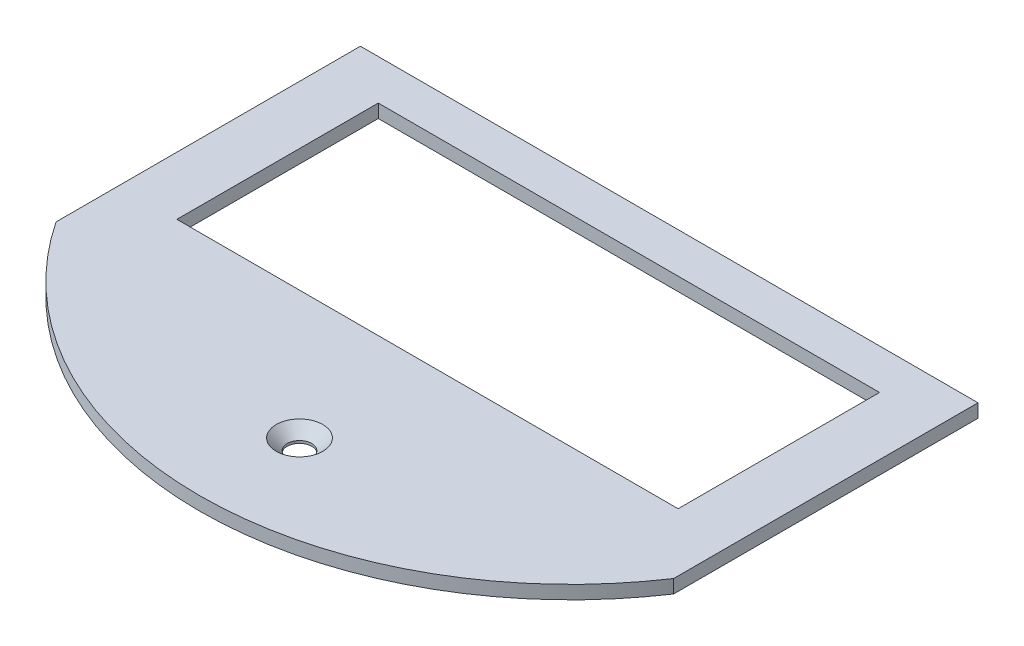
ISO-10303-21;
HEADER;
FILE_DESCRIPTION(('STEP AP214'),'2;1');
FILE_NAME('part.step','',(''),(''),'','','');
FILE_SCHEMA(('AUTOMOTIVE_DESIGN { 1 0 10303 214 1 1 1 1 }'));
ENDSEC;
DATA;
#1=APPLICATION_CONTEXT('core data for automotive mechanical design processes');
#2=APPLICATION_PROTOCOL_DEFINITION('international standard','automotive_design',2000,#1);
#3=PRODUCT_CONTEXT('',#1,'mechanical');
#4=PRODUCT('Part','Part','',(#3));
#5=PRODUCT_RELATED_PRODUCT_CATEGORY('part','',(#4));
#6=PRODUCT_DEFINITION_FORMATION('','',#4);
#7=PRODUCT_DEFINITION_CONTEXT('part definition',#1,'design');
#8=PRODUCT_DEFINITION('design','',#6,#7);
#9=PRODUCT_DEFINITION_SHAPE('','',#8);
#10=(LENGTH_UNIT() NAMED_UNIT(*) SI_UNIT(.MILLI.,.METRE.));
#11=(NAMED_UNIT(*) PLANE_ANGLE_UNIT() SI_UNIT($,.RADIAN.));
#12=(NAMED_UNIT(*) SI_UNIT($,.STERADIAN.) SOLID_ANGLE_UNIT());
#13=UNCERTAINTY_MEASURE_WITH_UNIT(LENGTH_MEASURE(1.E-05),#10,'distance_accuracy_value','');
#14=(GEOMETRIC_REPRESENTATION_CONTEXT(3) GLOBAL_UNCERTAINTY_ASSIGNED_CONTEXT((#13)) GLOBAL_UNIT_ASSIGNED_CONTEXT((#10,
#11,#12)) REPRESENTATION_CONTEXT('',''));
#15=CARTESIAN_POINT('',(0.,0.,0.));
#16=DIRECTION('',(0.,0.,1.));
#17=DIRECTION('',(1.,0.,0.));
#18=AXIS2_PLACEMENT_3D('',#15,#16,#17);
#19=CARTESIAN_POINT('',(0.,3.,0.));
#20=DIRECTION('',(1.,0.,0.));
#21=DIRECTION('',(0.,0.,-1.));
#22=AXIS2_PLACEMENT_3D('',#19,#20,#21);
#23=PLANE('',#22);
#24=DIRECTION('',(0.,0.,1.));
#25=VECTOR('',#24,1.);
#26=CARTESIAN_POINT('',(0.,0.,0.));
#27=LINE('',#26,#25);
#28=CARTESIAN_POINT('',(0.,0.,0.));
#29=VERTEX_POINT('',#28);
#30=CARTESIAN_POINT('',(0.,0.,68.));
#31=VERTEX_POINT('',#30);
#32=EDGE_CURVE('E134',#29,#31,#27,.T.);
#33=ORIENTED_EDGE('',*,*,#32,.T.);
#34=DIRECTION('',(0.,-1.,0.));
#35=VECTOR('',#34,1.);
#36=CARTESIAN_POINT('',(0.,3.,68.));
#37=LINE('',#36,#35);
#38=CARTESIAN_POINT('',(0.,3.,68.));
#39=VERTEX_POINT('',#38);
#40=EDGE_CURVE('E11',#39,#31,#37,.T.);
#41=ORIENTED_EDGE('',*,*,#40,.F.);
#42=DIRECTION('',(0.,0.,1.));
#43=VECTOR('',#42,1.);
#44=CARTESIAN_POINT('',(0.,3.,0.));
#45=LINE('',#44,#43);
#46=CARTESIAN_POINT('',(0.,3.,0.));
#47=VERTEX_POINT('',#46);
#48=EDGE_CURVE('E138',#47,#39,#45,.T.);
#49=ORIENTED_EDGE('',*,*,#48,.F.);
#50=DIRECTION('',(0.,-1.,0.));
#51=VECTOR('',#50,1.);
#52=CARTESIAN_POINT('',(0.,3.,0.));
#53=LINE('',#52,#51);
#54=EDGE_CURVE('E148',#47,#29,#53,.T.);
#55=ORIENTED_EDGE('',*,*,#54,.T.);
#56=EDGE_LOOP('',(#33,#41,#49,#55));
#57=FACE_BOUND('',#56,.T.);
#58=ADVANCED_FACE('F34',(#57),#23,.F.);
#59=CARTESIAN_POINT('',(69.,3.,22.));
#60=DIRECTION('',(0.,-1.,0.));
#61=DIRECTION('',(0.,0.,-1.));
#62=AXIS2_PLACEMENT_3D('',#59,#60,#61);
#63=CYLINDRICAL_SURFACE('',#62,82.9276793356717);
#64=CARTESIAN_POINT('',(69.,0.,22.));
#65=DIRECTION('',(0.,1.,0.));
#66=DIRECTION('',(0.,0.,1.));
#67=AXIS2_PLACEMENT_3D('',#64,#65,#66);
#68=CIRCLE('',#67,82.9276793356717);
#69=CARTESIAN_POINT('',(138.,0.,68.));
#70=VERTEX_POINT('',#69);
#71=EDGE_CURVE('E151',#31,#70,#68,.T.);
#72=ORIENTED_EDGE('',*,*,#71,.T.);
#73=DIRECTION('',(0.,-1.,0.));
#74=VECTOR('',#73,1.);
#75=CARTESIAN_POINT('',(138.,3.,68.));
#76=LINE('',#75,#74);
#77=CARTESIAN_POINT('',(138.,3.,68.));
#78=VERTEX_POINT('',#77);
#79=EDGE_CURVE('E41',#78,#70,#76,.T.);
#80=ORIENTED_EDGE('',*,*,#79,.F.);
#81=CARTESIAN_POINT('',(69.,3.,22.));
#82=DIRECTION('',(0.,1.,0.));
#83=DIRECTION('',(0.,0.,1.));
#84=AXIS2_PLACEMENT_3D('',#81,#82,#83);
#85=CIRCLE('',#84,82.9276793356717);
#86=EDGE_CURVE('E141',#39,#78,#85,.T.);
#87=ORIENTED_EDGE('',*,*,#86,.F.);
#88=ORIENTED_EDGE('',*,*,#40,.T.);
#89=EDGE_LOOP('',(#72,#80,#87,#88));
#90=FACE_BOUND('',#89,.T.);
#91=ADVANCED_FACE('F179',(#90),#63,.T.);
#92=CARTESIAN_POINT('',(138.,3.,0.));
#93=DIRECTION('',(-1.,0.,0.));
#94=DIRECTION('',(0.,0.,1.));
#95=AXIS2_PLACEMENT_3D('',#92,#93,#94);
#96=PLANE('',#95);
#97=DIRECTION('',(0.,0.,-1.));
#98=VECTOR('',#97,1.);
#99=CARTESIAN_POINT('',(138.,0.,0.));
#100=LINE('',#99,#98);
#101=CARTESIAN_POINT('',(138.,0.,0.));
#102=VERTEX_POINT('',#101);
#103=EDGE_CURVE('E153',#70,#102,#100,.T.);
#104=ORIENTED_EDGE('',*,*,#103,.T.);
#105=DIRECTION('',(0.,-1.,0.));
#106=VECTOR('',#105,1.);
#107=CARTESIAN_POINT('',(138.,3.,0.));
#108=LINE('',#107,#106);
#109=CARTESIAN_POINT('',(138.,3.,0.));
#110=VERTEX_POINT('',#109);
#111=EDGE_CURVE('E158',#110,#102,#108,.T.);
#112=ORIENTED_EDGE('',*,*,#111,.F.);
#113=DIRECTION('',(0.,0.,-1.));
#114=VECTOR('',#113,1.);
#115=CARTESIAN_POINT('',(138.,3.,0.));
#116=LINE('',#115,#114);
#117=EDGE_CURVE('E144',#78,#110,#116,.T.);
#118=ORIENTED_EDGE('',*,*,#117,.F.);
#119=ORIENTED_EDGE('',*,*,#79,.T.);
#120=EDGE_LOOP('',(#104,#112,#118,#119));
#121=FACE_BOUND('',#120,.T.);
#122=ADVANCED_FACE('F165',(#121),#96,.F.);
#123=CARTESIAN_POINT('',(0.,3.,0.));
#124=DIRECTION('',(0.,0.,1.));
#125=DIRECTION('',(1.,0.,0.));
#126=AXIS2_PLACEMENT_3D('',#123,#124,#125);
#127=PLANE('',#126);
#128=DIRECTION('',(-1.,0.,0.));
#129=VECTOR('',#128,1.);
#130=CARTESIAN_POINT('',(0.,0.,0.));
#131=LINE('',#130,#129);
#132=EDGE_CURVE('E142',#102,#29,#131,.T.);
#133=ORIENTED_EDGE('',*,*,#132,.T.);
#134=ORIENTED_EDGE('',*,*,#54,.F.);
#135=DIRECTION('',(-1.,0.,0.));
#136=VECTOR('',#135,1.);
#137=CARTESIAN_POINT('',(0.,3.,0.));
#138=LINE('',#137,#136);
#139=EDGE_CURVE('E146',#110,#47,#138,.T.);
#140=ORIENTED_EDGE('',*,*,#139,.F.);
#141=ORIENTED_EDGE('',*,*,#111,.T.);
#142=EDGE_LOOP('',(#133,#134,#140,#141));
#143=FACE_BOUND('',#142,.T.);
#144=ADVANCED_FACE('F172',(#143),#127,.F.);
#145=CARTESIAN_POINT('',(69.,3.,22.));
#146=DIRECTION('',(0.,1.,0.));
#147=DIRECTION('',(0.,0.,1.));
#148=AXIS2_PLACEMENT_3D('',#145,#146,#147);
#149=PLANE('',#148);
#150=CARTESIAN_POINT('',(69.,3.,82.6));
#151=DIRECTION('',(0.,1.,0.));
#152=DIRECTION('',(0.,0.,1.));
#153=AXIS2_PLACEMENT_3D('',#150,#151,#152);
#154=CIRCLE('',#153,5.2);
#155=CARTESIAN_POINT('',(69.,3.,87.8));
#156=VERTEX_POINT('',#155);
#157=EDGE_CURVE('E221',#156,#156,#154,.T.);
#158=ORIENTED_EDGE('',*,*,#157,.F.);
#159=EDGE_LOOP('',(#158));
#160=FACE_BOUND('',#159,.T.);
#161=DIRECTION('',(0.,0.,1.));
#162=VECTOR('',#161,1.);
#163=CARTESIAN_POINT('',(13.,3.,9.));
#164=LINE('',#163,#162);
#165=CARTESIAN_POINT('',(13.,3.,9.));
#166=VERTEX_POINT('',#165);
#167=CARTESIAN_POINT('',(13.,3.,54.));
#168=VERTEX_POINT('',#167);
#169=EDGE_CURVE('E48',#166,#168,#164,.T.);
#170=ORIENTED_EDGE('',*,*,#169,.F.);
#171=DIRECTION('',(-1.,0.,0.));
#172=VECTOR('',#171,1.);
#173=CARTESIAN_POINT('',(13.,3.,9.));
#174=LINE('',#173,#172);
#175=CARTESIAN_POINT('',(125.,3.,9.));
#176=VERTEX_POINT('',#175);
#177=EDGE_CURVE('E116',#176,#166,#174,.T.);
#178=ORIENTED_EDGE('',*,*,#177,.F.);
#179=DIRECTION('',(0.,0.,-1.));
#180=VECTOR('',#179,1.);
#181=CARTESIAN_POINT('',(125.,3.,9.));
#182=LINE('',#181,#180);
#183=CARTESIAN_POINT('',(125.,3.,54.));
#184=VERTEX_POINT('',#183);
#185=EDGE_CURVE('E119',#184,#176,#182,.T.);
#186=ORIENTED_EDGE('',*,*,#185,.F.);
#187=DIRECTION('',(1.,0.,0.));
#188=VECTOR('',#187,1.);
#189=CARTESIAN_POINT('',(13.,3.,54.));
#190=LINE('',#189,#188);
#191=EDGE_CURVE('E128',#168,#184,#190,.T.);
#192=ORIENTED_EDGE('',*,*,#191,.F.);
#193=EDGE_LOOP('',(#170,#178,#186,#192));
#194=FACE_BOUND('',#193,.T.);
#195=ORIENTED_EDGE('',*,*,#48,.T.);
#196=ORIENTED_EDGE('',*,*,#86,.T.);
#197=ORIENTED_EDGE('',*,*,#117,.T.);
#198=ORIENTED_EDGE('',*,*,#139,.T.);
#199=EDGE_LOOP('',(#195,#196,#197,#198));
#200=FACE_BOUND('',#199,.T.);
#201=ADVANCED_FACE('F178',(#160,#194,#200),#149,.T.);
#202=CARTESIAN_POINT('',(69.,0.,22.));
#203=DIRECTION('',(0.,1.,0.));
#204=DIRECTION('',(0.,0.,1.));
#205=AXIS2_PLACEMENT_3D('',#202,#203,#204);
#206=PLANE('',#205);
#207=CARTESIAN_POINT('',(69.,0.,82.6));
#208=DIRECTION('',(0.,1.,0.));
#209=DIRECTION('',(0.,0.,1.));
#210=AXIS2_PLACEMENT_3D('',#207,#208,#209);
#211=CIRCLE('',#210,2.75);
#212=CARTESIAN_POINT('',(69.,0.,85.35));
#213=VERTEX_POINT('',#212);
#214=EDGE_CURVE('E122',#213,#213,#211,.T.);
#215=ORIENTED_EDGE('',*,*,#214,.T.);
#216=EDGE_LOOP('',(#215));
#217=FACE_BOUND('',#216,.T.);
#218=DIRECTION('',(-1.,0.,0.));
#219=VECTOR('',#218,1.);
#220=CARTESIAN_POINT('',(13.,0.,9.));
#221=LINE('',#220,#219);
#222=CARTESIAN_POINT('',(125.,0.,9.));
#223=VERTEX_POINT('',#222);
#224=CARTESIAN_POINT('',(13.,0.,9.));
#225=VERTEX_POINT('',#224);
#226=EDGE_CURVE('E106',#223,#225,#221,.T.);
#227=ORIENTED_EDGE('',*,*,#226,.T.);
#228=DIRECTION('',(0.,0.,1.));
#229=VECTOR('',#228,1.);
#230=CARTESIAN_POINT('',(13.,0.,9.));
#231=LINE('',#230,#229);
#232=CARTESIAN_POINT('',(13.,0.,54.));
#233=VERTEX_POINT('',#232);
#234=EDGE_CURVE('E100',#225,#233,#231,.T.);
#235=ORIENTED_EDGE('',*,*,#234,.T.);
#236=DIRECTION('',(1.,0.,0.));
#237=VECTOR('',#236,1.);
#238=CARTESIAN_POINT('',(13.,0.,54.));
#239=LINE('',#238,#237);
#240=CARTESIAN_POINT('',(125.,0.,54.));
#241=VERTEX_POINT('',#240);
#242=EDGE_CURVE('E109',#233,#241,#239,.T.);
#243=ORIENTED_EDGE('',*,*,#242,.T.);
#244=DIRECTION('',(0.,0.,-1.));
#245=VECTOR('',#244,1.);
#246=CARTESIAN_POINT('',(125.,0.,9.));
#247=LINE('',#246,#245);
#248=EDGE_CURVE('E56',#241,#223,#247,.T.);
#249=ORIENTED_EDGE('',*,*,#248,.T.);
#250=EDGE_LOOP('',(#227,#235,#243,#249));
#251=FACE_BOUND('',#250,.T.);
#252=ORIENTED_EDGE('',*,*,#32,.F.);
#253=ORIENTED_EDGE('',*,*,#132,.F.);
#254=ORIENTED_EDGE('',*,*,#103,.F.);
#255=ORIENTED_EDGE('',*,*,#71,.F.);
#256=EDGE_LOOP('',(#252,#253,#254,#255));
#257=FACE_BOUND('',#256,.T.);
#258=ADVANCED_FACE('F113',(#217,#251,#257),#206,.F.);
#259=CARTESIAN_POINT('',(13.,0.,9.));
#260=DIRECTION('',(-1.,0.,0.));
#261=DIRECTION('',(0.,0.,1.));
#262=AXIS2_PLACEMENT_3D('',#259,#260,#261);
#263=PLANE('',#262);
#264=ORIENTED_EDGE('',*,*,#169,.T.);
#265=DIRECTION('',(0.,1.,0.));
#266=VECTOR('',#265,1.);
#267=CARTESIAN_POINT('',(13.,0.,54.));
#268=LINE('',#267,#266);
#269=EDGE_CURVE('E96',#233,#168,#268,.T.);
#270=ORIENTED_EDGE('',*,*,#269,.F.);
#271=ORIENTED_EDGE('',*,*,#234,.F.);
#272=DIRECTION('',(0.,1.,0.));
#273=VECTOR('',#272,1.);
#274=CARTESIAN_POINT('',(13.,0.,9.));
#275=LINE('',#274,#273);
#276=EDGE_CURVE('E132',#225,#166,#275,.T.);
#277=ORIENTED_EDGE('',*,*,#276,.T.);
#278=EDGE_LOOP('',(#264,#270,#271,#277));
#279=FACE_BOUND('',#278,.T.);
#280=ADVANCED_FACE('F98',(#279),#263,.F.);
#281=CARTESIAN_POINT('',(13.,0.,9.));
#282=DIRECTION('',(0.,0.,-1.));
#283=DIRECTION('',(-1.,0.,0.));
#284=AXIS2_PLACEMENT_3D('',#281,#282,#283);
#285=PLANE('',#284);
#286=ORIENTED_EDGE('',*,*,#177,.T.);
#287=ORIENTED_EDGE('',*,*,#276,.F.);
#288=ORIENTED_EDGE('',*,*,#226,.F.);
#289=DIRECTION('',(0.,1.,0.));
#290=VECTOR('',#289,1.);
#291=CARTESIAN_POINT('',(125.,0.,9.));
#292=LINE('',#291,#290);
#293=EDGE_CURVE('E135',#223,#176,#292,.T.);
#294=ORIENTED_EDGE('',*,*,#293,.T.);
#295=EDGE_LOOP('',(#286,#287,#288,#294));
#296=FACE_BOUND('',#295,.T.);
#297=ADVANCED_FACE('F197',(#296),#285,.F.);
#298=CARTESIAN_POINT('',(125.,0.,9.));
#299=DIRECTION('',(1.,0.,0.));
#300=DIRECTION('',(0.,0.,-1.));
#301=AXIS2_PLACEMENT_3D('',#298,#299,#300);
#302=PLANE('',#301);
#303=ORIENTED_EDGE('',*,*,#185,.T.);
#304=ORIENTED_EDGE('',*,*,#293,.F.);
#305=ORIENTED_EDGE('',*,*,#248,.F.);
#306=DIRECTION('',(0.,1.,0.));
#307=VECTOR('',#306,1.);
#308=CARTESIAN_POINT('',(125.,0.,54.));
#309=LINE('',#308,#307);
#310=EDGE_CURVE('E105',#241,#184,#309,.T.);
#311=ORIENTED_EDGE('',*,*,#310,.T.);
#312=EDGE_LOOP('',(#303,#304,#305,#311));
#313=FACE_BOUND('',#312,.T.);
#314=ADVANCED_FACE('F201',(#313),#302,.F.);
#315=CARTESIAN_POINT('',(13.,0.,54.));
#316=DIRECTION('',(0.,0.,1.));
#317=DIRECTION('',(1.,0.,0.));
#318=AXIS2_PLACEMENT_3D('',#315,#316,#317);
#319=PLANE('',#318);
#320=ORIENTED_EDGE('',*,*,#191,.T.);
#321=ORIENTED_EDGE('',*,*,#310,.F.);
#322=ORIENTED_EDGE('',*,*,#242,.F.);
#323=ORIENTED_EDGE('',*,*,#269,.T.);
#324=EDGE_LOOP('',(#320,#321,#322,#323));
#325=FACE_BOUND('',#324,.T.);
#326=ADVANCED_FACE('F110',(#325),#319,.F.);
#327=CARTESIAN_POINT('',(69.,3.,82.6));
#328=DIRECTION('',(0.,1.,0.));
#329=DIRECTION('',(0.,0.,1.));
#330=AXIS2_PLACEMENT_3D('',#327,#328,#329);
#331=CYLINDRICAL_SURFACE('',#330,2.75);
#332=ORIENTED_EDGE('',*,*,#214,.F.);
#333=EDGE_LOOP('',(#332));
#334=FACE_BOUND('',#333,.T.);
#335=CARTESIAN_POINT('',(69.,0.549999999999997,82.6));
#336=DIRECTION('',(0.,1.,0.));
#337=DIRECTION('',(0.,0.,1.));
#338=AXIS2_PLACEMENT_3D('',#335,#336,#337);
#339=CIRCLE('',#338,2.75);
#340=CARTESIAN_POINT('',(69.,0.549999999999997,85.35));
#341=VERTEX_POINT('',#340);
#342=EDGE_CURVE('E218',#341,#341,#339,.T.);
#343=ORIENTED_EDGE('',*,*,#342,.T.);
#344=EDGE_LOOP('',(#343));
#345=FACE_BOUND('',#344,.T.);
#346=ADVANCED_FACE('F200',(#334,#345),#331,.F.);
#347=CARTESIAN_POINT('',(69.,3.,82.6));
#348=DIRECTION('',(0.,1.,0.));
#349=DIRECTION('',(0.,0.,1.));
#350=AXIS2_PLACEMENT_3D('',#347,#348,#349);
#351=CONICAL_SURFACE('',#350,5.2,0.785398163397447);
#352=ORIENTED_EDGE('',*,*,#342,.F.);
#353=EDGE_LOOP('',(#352));
#354=FACE_BOUND('',#353,.T.);
#355=ORIENTED_EDGE('',*,*,#157,.T.);
#356=EDGE_LOOP('',(#355));
#357=FACE_BOUND('',#356,.T.);
#358=ADVANCED_FACE('F209',(#354,#357),#351,.F.);
#359=CLOSED_SHELL('',(#58,#91,#122,#144,#201,#258,#280,#297,#314,#326,#346,#358));
#360=MANIFOLD_SOLID_BREP('B2',#359);
#361=ADVANCED_BREP_SHAPE_REPRESENTATION('',(#18,#360),#14);
#362=SHAPE_DEFINITION_REPRESENTATION(#9,#361);
ENDSEC;
END-ISO-10303-21;
